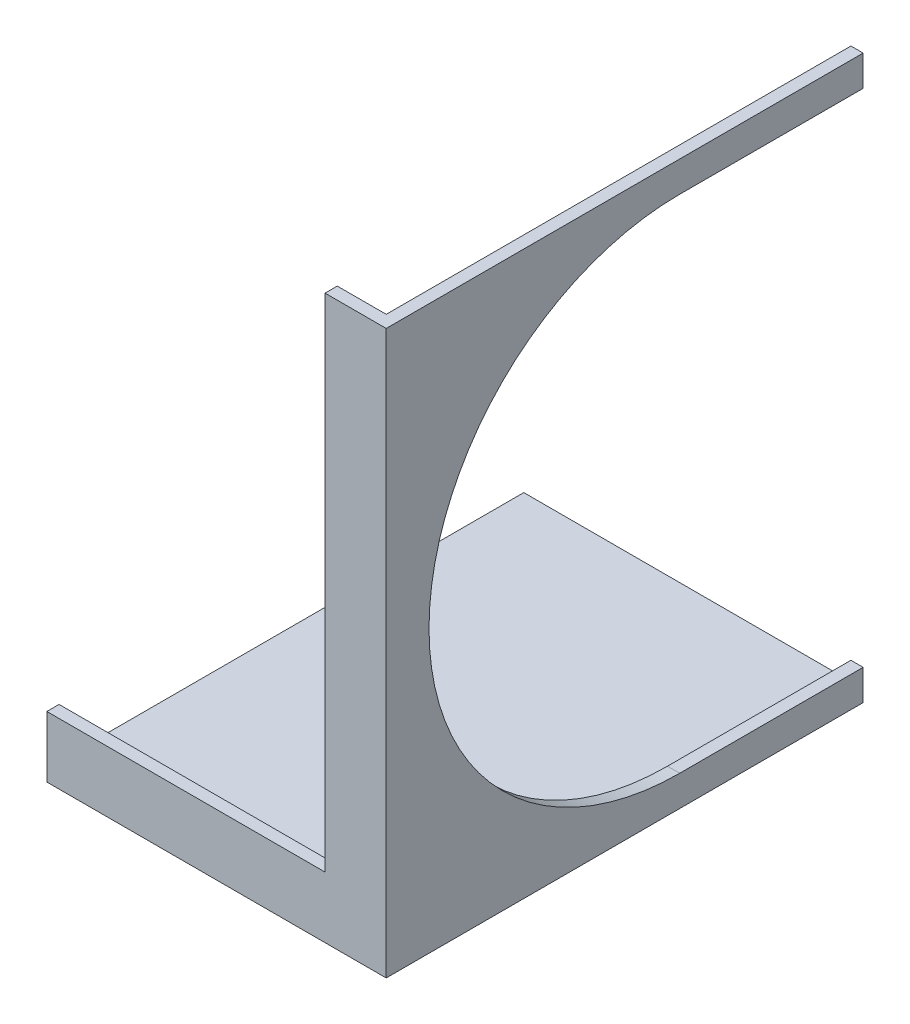
ISO-10303-21;
HEADER;
FILE_DESCRIPTION(('STEP AP214'),'2;1');
FILE_NAME('part.step','',(''),(''),'','','');
FILE_SCHEMA(('AUTOMOTIVE_DESIGN { 1 0 10303 214 1 1 1 1 }'));
ENDSEC;
DATA;
#1=APPLICATION_CONTEXT('core data for automotive mechanical design processes');
#2=APPLICATION_PROTOCOL_DEFINITION('international standard','automotive_design',2000,#1);
#3=PRODUCT_CONTEXT('',#1,'mechanical');
#4=PRODUCT('Part','Part','',(#3));
#5=PRODUCT_RELATED_PRODUCT_CATEGORY('part','',(#4));
#6=PRODUCT_DEFINITION_FORMATION('','',#4);
#7=PRODUCT_DEFINITION_CONTEXT('part definition',#1,'design');
#8=PRODUCT_DEFINITION('design','',#6,#7);
#9=PRODUCT_DEFINITION_SHAPE('','',#8);
#10=(LENGTH_UNIT() NAMED_UNIT(*) SI_UNIT(.MILLI.,.METRE.));
#11=(NAMED_UNIT(*) PLANE_ANGLE_UNIT() SI_UNIT($,.RADIAN.));
#12=(NAMED_UNIT(*) SI_UNIT($,.STERADIAN.) SOLID_ANGLE_UNIT());
#13=UNCERTAINTY_MEASURE_WITH_UNIT(LENGTH_MEASURE(1.E-05),#10,'distance_accuracy_value','');
#14=(GEOMETRIC_REPRESENTATION_CONTEXT(3) GLOBAL_UNCERTAINTY_ASSIGNED_CONTEXT((#13)) GLOBAL_UNIT_ASSIGNED_CONTEXT((#10,
#11,#12)) REPRESENTATION_CONTEXT('',''));
#15=CARTESIAN_POINT('',(0.,0.,0.));
#16=DIRECTION('',(0.,0.,1.));
#17=DIRECTION('',(1.,0.,0.));
#18=AXIS2_PLACEMENT_3D('',#15,#16,#17);
#19=CARTESIAN_POINT('',(0.,0.,0.));
#20=DIRECTION('',(0.,0.,1.));
#21=DIRECTION('',(1.,0.,0.));
#22=AXIS2_PLACEMENT_3D('',#19,#20,#21);
#23=PLANE('',#22);
#24=DIRECTION('',(0.,1.,0.));
#25=VECTOR('',#24,1.);
#26=CARTESIAN_POINT('',(0.,0.,0.));
#27=LINE('',#26,#25);
#28=CARTESIAN_POINT('',(0.,87.,0.));
#29=VERTEX_POINT('',#28);
#30=CARTESIAN_POINT('',(0.,92.,0.));
#31=VERTEX_POINT('',#30);
#32=EDGE_CURVE('E112',#29,#31,#27,.T.);
#33=ORIENTED_EDGE('',*,*,#32,.F.);
#34=DIRECTION('',(-1.,0.,0.));
#35=VECTOR('',#34,1.);
#36=CARTESIAN_POINT('',(0.,87.,0.));
#37=LINE('',#36,#35);
#38=CARTESIAN_POINT('',(-1.99999999999999,87.,0.));
#39=VERTEX_POINT('',#38);
#40=EDGE_CURVE('E43',#29,#39,#37,.T.);
#41=ORIENTED_EDGE('',*,*,#40,.T.);
#42=DIRECTION('',(0.,-1.,0.));
#43=VECTOR('',#42,1.);
#44=CARTESIAN_POINT('',(-2.,92.,0.));
#45=LINE('',#44,#43);
#46=CARTESIAN_POINT('',(-2.,92.,0.));
#47=VERTEX_POINT('',#46);
#48=EDGE_CURVE('E94',#47,#39,#45,.T.);
#49=ORIENTED_EDGE('',*,*,#48,.F.);
#50=DIRECTION('',(-1.,0.,0.));
#51=VECTOR('',#50,1.);
#52=CARTESIAN_POINT('',(0.,92.,0.));
#53=LINE('',#52,#51);
#54=EDGE_CURVE('E123',#31,#47,#53,.T.);
#55=ORIENTED_EDGE('',*,*,#54,.F.);
#56=EDGE_LOOP('',(#33,#41,#49,#55));
#57=FACE_BOUND('',#56,.T.);
#58=ADVANCED_FACE('F35',(#57),#23,.F.);
#59=CARTESIAN_POINT('',(-55.5,2.,76.));
#60=DIRECTION('',(1.,0.,0.));
#61=DIRECTION('',(0.,0.,-1.));
#62=AXIS2_PLACEMENT_3D('',#59,#60,#61);
#63=PLANE('',#62);
#64=DIRECTION('',(0.,-1.,0.));
#65=VECTOR('',#64,1.);
#66=CARTESIAN_POINT('',(-55.5,2.,0.));
#67=LINE('',#66,#65);
#68=CARTESIAN_POINT('',(-55.5,2.,0.));
#69=VERTEX_POINT('',#68);
#70=CARTESIAN_POINT('',(-55.5,0.,0.));
#71=VERTEX_POINT('',#70);
#72=EDGE_CURVE('E100',#69,#71,#67,.T.);
#73=ORIENTED_EDGE('',*,*,#72,.T.);
#74=DIRECTION('',(0.,0.,-1.));
#75=VECTOR('',#74,1.);
#76=CARTESIAN_POINT('',(-55.5,0.,76.));
#77=LINE('',#76,#75);
#78=CARTESIAN_POINT('',(-55.5,0.,78.));
#79=VERTEX_POINT('',#78);
#80=EDGE_CURVE('E138',#79,#71,#77,.T.);
#81=ORIENTED_EDGE('',*,*,#80,.F.);
#82=DIRECTION('',(0.,-1.,0.));
#83=VECTOR('',#82,1.);
#84=CARTESIAN_POINT('',(-55.5,9.99999999999999,78.));
#85=LINE('',#84,#83);
#86=CARTESIAN_POINT('',(-55.5,9.99999999999999,78.));
#87=VERTEX_POINT('',#86);
#88=EDGE_CURVE('E283',#87,#79,#85,.T.);
#89=ORIENTED_EDGE('',*,*,#88,.F.);
#90=DIRECTION('',(0.,0.,-1.));
#91=VECTOR('',#90,1.);
#92=CARTESIAN_POINT('',(-55.5,9.99999999999999,78.));
#93=LINE('',#92,#91);
#94=CARTESIAN_POINT('',(-55.5,9.99999999999999,76.));
#95=VERTEX_POINT('',#94);
#96=EDGE_CURVE('E235',#87,#95,#93,.T.);
#97=ORIENTED_EDGE('',*,*,#96,.T.);
#98=DIRECTION('',(0.,-1.,0.));
#99=VECTOR('',#98,1.);
#100=CARTESIAN_POINT('',(-55.5,9.99999999999999,76.));
#101=LINE('',#100,#99);
#102=CARTESIAN_POINT('',(-55.5,2.,76.));
#103=VERTEX_POINT('',#102);
#104=EDGE_CURVE('E103',#95,#103,#101,.T.);
#105=ORIENTED_EDGE('',*,*,#104,.T.);
#106=DIRECTION('',(0.,0.,-1.));
#107=VECTOR('',#106,1.);
#108=CARTESIAN_POINT('',(-55.5,2.,76.));
#109=LINE('',#108,#107);
#110=EDGE_CURVE('E88',#103,#69,#109,.T.);
#111=ORIENTED_EDGE('',*,*,#110,.T.);
#112=EDGE_LOOP('',(#73,#81,#89,#97,#105,#111));
#113=FACE_BOUND('',#112,.T.);
#114=ADVANCED_FACE('F37',(#113),#63,.F.);
#115=CARTESIAN_POINT('',(-55.5,0.,76.));
#116=DIRECTION('',(0.,1.,0.));
#117=DIRECTION('',(0.,0.,1.));
#118=AXIS2_PLACEMENT_3D('',#115,#116,#117);
#119=PLANE('',#118);
#120=DIRECTION('',(1.,0.,0.));
#121=VECTOR('',#120,1.);
#122=CARTESIAN_POINT('',(-55.5,0.,0.));
#123=LINE('',#122,#121);
#124=CARTESIAN_POINT('',(0.,0.,0.));
#125=VERTEX_POINT('',#124);
#126=EDGE_CURVE('E108',#71,#125,#123,.T.);
#127=ORIENTED_EDGE('',*,*,#126,.T.);
#128=DIRECTION('',(0.,0.,-1.));
#129=VECTOR('',#128,1.);
#130=CARTESIAN_POINT('',(0.,0.,76.));
#131=LINE('',#130,#129);
#132=CARTESIAN_POINT('',(0.,0.,78.));
#133=VERTEX_POINT('',#132);
#134=EDGE_CURVE('E135',#133,#125,#131,.T.);
#135=ORIENTED_EDGE('',*,*,#134,.F.);
#136=DIRECTION('',(1.,0.,0.));
#137=VECTOR('',#136,1.);
#138=CARTESIAN_POINT('',(-55.5,0.,78.));
#139=LINE('',#138,#137);
#140=EDGE_CURVE('E238',#79,#133,#139,.T.);
#141=ORIENTED_EDGE('',*,*,#140,.F.);
#142=ORIENTED_EDGE('',*,*,#80,.T.);
#143=EDGE_LOOP('',(#127,#135,#141,#142));
#144=FACE_BOUND('',#143,.T.);
#145=ADVANCED_FACE('F260',(#144),#119,.F.);
#146=CARTESIAN_POINT('',(0.,0.,76.));
#147=DIRECTION('',(-1.,0.,0.));
#148=DIRECTION('',(0.,0.,1.));
#149=AXIS2_PLACEMENT_3D('',#146,#147,#148);
#150=PLANE('',#149);
#151=CARTESIAN_POINT('',(0.,46.,30.));
#152=DIRECTION('',(1.,0.,0.));
#153=DIRECTION('',(0.,0.,-1.));
#154=AXIS2_PLACEMENT_3D('',#151,#152,#153);
#155=CIRCLE('',#154,41.);
#156=CARTESIAN_POINT('',(0.,87.,30.));
#157=VERTEX_POINT('',#156);
#158=CARTESIAN_POINT('',(0.,4.99999999999999,30.));
#159=VERTEX_POINT('',#158);
#160=EDGE_CURVE('E243',#157,#159,#155,.T.);
#161=ORIENTED_EDGE('',*,*,#160,.F.);
#162=DIRECTION('',(0.,0.,1.));
#163=VECTOR('',#162,1.);
#164=CARTESIAN_POINT('',(0.,87.,30.));
#165=LINE('',#164,#163);
#166=EDGE_CURVE('E218',#29,#157,#165,.T.);
#167=ORIENTED_EDGE('',*,*,#166,.F.);
#168=ORIENTED_EDGE('',*,*,#32,.T.);
#169=DIRECTION('',(0.,0.,-1.));
#170=VECTOR('',#169,1.);
#171=CARTESIAN_POINT('',(0.,92.,76.));
#172=LINE('',#171,#170);
#173=CARTESIAN_POINT('',(0.,92.,78.));
#174=VERTEX_POINT('',#173);
#175=EDGE_CURVE('E132',#174,#31,#172,.T.);
#176=ORIENTED_EDGE('',*,*,#175,.F.);
#177=DIRECTION('',(0.,1.,0.));
#178=VECTOR('',#177,1.);
#179=CARTESIAN_POINT('',(0.,0.,78.));
#180=LINE('',#179,#178);
#181=EDGE_CURVE('E176',#133,#174,#180,.T.);
#182=ORIENTED_EDGE('',*,*,#181,.F.);
#183=ORIENTED_EDGE('',*,*,#134,.T.);
#184=CARTESIAN_POINT('',(0.,4.99999999999999,0.));
#185=VERTEX_POINT('',#184);
#186=EDGE_CURVE('E120',#125,#185,#27,.T.);
#187=ORIENTED_EDGE('',*,*,#186,.T.);
#188=DIRECTION('',(0.,0.,-1.));
#189=VECTOR('',#188,1.);
#190=CARTESIAN_POINT('',(0.,4.99999999999999,30.));
#191=LINE('',#190,#189);
#192=EDGE_CURVE('E50',#159,#185,#191,.T.);
#193=ORIENTED_EDGE('',*,*,#192,.F.);
#194=EDGE_LOOP('',(#161,#167,#168,#176,#182,#183,#187,#193));
#195=FACE_BOUND('',#194,.T.);
#196=ADVANCED_FACE('F174',(#195),#150,.F.);
#197=CARTESIAN_POINT('',(0.,92.,76.));
#198=DIRECTION('',(0.,-1.,0.));
#199=DIRECTION('',(0.,0.,-1.));
#200=AXIS2_PLACEMENT_3D('',#197,#198,#199);
#201=PLANE('',#200);
#202=ORIENTED_EDGE('',*,*,#54,.T.);
#203=DIRECTION('',(0.,0.,-1.));
#204=VECTOR('',#203,1.);
#205=CARTESIAN_POINT('',(-2.,92.,76.));
#206=LINE('',#205,#204);
#207=CARTESIAN_POINT('',(-2.,92.,76.));
#208=VERTEX_POINT('',#207);
#209=EDGE_CURVE('E129',#208,#47,#206,.T.);
#210=ORIENTED_EDGE('',*,*,#209,.F.);
#211=DIRECTION('',(-1.,0.,0.));
#212=VECTOR('',#211,1.);
#213=CARTESIAN_POINT('',(0.,92.,76.));
#214=LINE('',#213,#212);
#215=CARTESIAN_POINT('',(-10.,92.,76.));
#216=VERTEX_POINT('',#215);
#217=EDGE_CURVE('E163',#208,#216,#214,.T.);
#218=ORIENTED_EDGE('',*,*,#217,.T.);
#219=DIRECTION('',(0.,0.,-1.));
#220=VECTOR('',#219,1.);
#221=CARTESIAN_POINT('',(-10.,92.,78.));
#222=LINE('',#221,#220);
#223=CARTESIAN_POINT('',(-10.,92.,78.));
#224=VERTEX_POINT('',#223);
#225=EDGE_CURVE('E241',#224,#216,#222,.T.);
#226=ORIENTED_EDGE('',*,*,#225,.F.);
#227=DIRECTION('',(-1.,0.,0.));
#228=VECTOR('',#227,1.);
#229=CARTESIAN_POINT('',(0.,92.,78.));
#230=LINE('',#229,#228);
#231=EDGE_CURVE('E169',#174,#224,#230,.T.);
#232=ORIENTED_EDGE('',*,*,#231,.F.);
#233=ORIENTED_EDGE('',*,*,#175,.T.);
#234=EDGE_LOOP('',(#202,#210,#218,#226,#232,#233));
#235=FACE_BOUND('',#234,.T.);
#236=ADVANCED_FACE('F160',(#235),#201,.F.);
#237=CARTESIAN_POINT('',(-2.,92.,76.));
#238=DIRECTION('',(1.,0.,0.));
#239=DIRECTION('',(0.,1.,0.));
#240=AXIS2_PLACEMENT_3D('',#237,#238,#239);
#241=PLANE('',#240);
#242=ORIENTED_EDGE('',*,*,#48,.T.);
#243=DIRECTION('',(0.,0.,1.));
#244=VECTOR('',#243,1.);
#245=CARTESIAN_POINT('',(-2.,87.,76.));
#246=LINE('',#245,#244);
#247=CARTESIAN_POINT('',(-2.,87.,30.));
#248=VERTEX_POINT('',#247);
#249=EDGE_CURVE('E110',#39,#248,#246,.T.);
#250=ORIENTED_EDGE('',*,*,#249,.T.);
#251=CARTESIAN_POINT('',(-2.,46.,30.));
#252=DIRECTION('',(1.,0.,0.));
#253=DIRECTION('',(0.,1.,0.));
#254=AXIS2_PLACEMENT_3D('',#251,#252,#253);
#255=CIRCLE('',#254,41.);
#256=CARTESIAN_POINT('',(-1.99999999999999,4.99999999999999,30.));
#257=VERTEX_POINT('',#256);
#258=EDGE_CURVE('E11',#248,#257,#255,.T.);
#259=ORIENTED_EDGE('',*,*,#258,.T.);
#260=DIRECTION('',(0.,0.,-1.));
#261=VECTOR('',#260,1.);
#262=CARTESIAN_POINT('',(-1.99999999999999,4.99999999999996,76.));
#263=LINE('',#262,#261);
#264=CARTESIAN_POINT('',(-1.99999999999999,5.,0.));
#265=VERTEX_POINT('',#264);
#266=EDGE_CURVE('E115',#257,#265,#263,.T.);
#267=ORIENTED_EDGE('',*,*,#266,.T.);
#268=CARTESIAN_POINT('',(-1.99999999999999,2.00000000000001,0.));
#269=VERTEX_POINT('',#268);
#270=EDGE_CURVE('E125',#265,#269,#45,.T.);
#271=ORIENTED_EDGE('',*,*,#270,.T.);
#272=DIRECTION('',(0.,0.,-1.));
#273=VECTOR('',#272,1.);
#274=CARTESIAN_POINT('',(-1.99999999999999,2.00000000000001,76.));
#275=LINE('',#274,#273);
#276=CARTESIAN_POINT('',(-1.99999999999999,2.00000000000001,76.));
#277=VERTEX_POINT('',#276);
#278=EDGE_CURVE('E59',#277,#269,#275,.T.);
#279=ORIENTED_EDGE('',*,*,#278,.F.);
#280=DIRECTION('',(0.,-1.,0.));
#281=VECTOR('',#280,1.);
#282=CARTESIAN_POINT('',(-2.,92.,76.));
#283=LINE('',#282,#281);
#284=EDGE_CURVE('E93',#208,#277,#283,.T.);
#285=ORIENTED_EDGE('',*,*,#284,.F.);
#286=ORIENTED_EDGE('',*,*,#209,.T.);
#287=EDGE_LOOP('',(#242,#250,#259,#267,#271,#279,#285,#286));
#288=FACE_BOUND('',#287,.T.);
#289=ADVANCED_FACE('F155',(#288),#241,.F.);
#290=CARTESIAN_POINT('',(-1.99999999999999,2.00000000000001,76.));
#291=DIRECTION('',(0.,-1.,0.));
#292=DIRECTION('',(1.,0.,0.));
#293=AXIS2_PLACEMENT_3D('',#290,#291,#292);
#294=PLANE('',#293);
#295=DIRECTION('',(-1.,0.,0.));
#296=VECTOR('',#295,1.);
#297=CARTESIAN_POINT('',(-1.99999999999999,2.00000000000001,0.));
#298=LINE('',#297,#296);
#299=EDGE_CURVE('E84',#269,#69,#298,.T.);
#300=ORIENTED_EDGE('',*,*,#299,.T.);
#301=ORIENTED_EDGE('',*,*,#110,.F.);
#302=DIRECTION('',(-1.,0.,0.));
#303=VECTOR('',#302,1.);
#304=CARTESIAN_POINT('',(-1.99999999999999,2.00000000000001,76.));
#305=LINE('',#304,#303);
#306=EDGE_CURVE('E104',#277,#103,#305,.T.);
#307=ORIENTED_EDGE('',*,*,#306,.F.);
#308=ORIENTED_EDGE('',*,*,#278,.T.);
#309=EDGE_LOOP('',(#300,#301,#307,#308));
#310=FACE_BOUND('',#309,.T.);
#311=ADVANCED_FACE('F86',(#310),#294,.F.);
#312=ORIENTED_EDGE('',*,*,#270,.F.);
#313=DIRECTION('',(1.,0.,0.));
#314=VECTOR('',#313,1.);
#315=CARTESIAN_POINT('',(0.,5.,0.));
#316=LINE('',#315,#314);
#317=EDGE_CURVE('E140',#265,#185,#316,.T.);
#318=ORIENTED_EDGE('',*,*,#317,.T.);
#319=ORIENTED_EDGE('',*,*,#186,.F.);
#320=ORIENTED_EDGE('',*,*,#126,.F.);
#321=ORIENTED_EDGE('',*,*,#72,.F.);
#322=ORIENTED_EDGE('',*,*,#299,.F.);
#323=EDGE_LOOP('',(#312,#318,#319,#320,#321,#322));
#324=FACE_BOUND('',#323,.T.);
#325=ADVANCED_FACE('F106',(#324),#23,.F.);
#326=CARTESIAN_POINT('',(-70.,46.,30.));
#327=DIRECTION('',(1.,0.,0.));
#328=DIRECTION('',(0.,0.,-1.));
#329=AXIS2_PLACEMENT_3D('',#326,#327,#328);
#330=CYLINDRICAL_SURFACE('',#329,41.);
#331=DIRECTION('',(1.,0.,0.));
#332=VECTOR('',#331,1.);
#333=CARTESIAN_POINT('',(-70.,87.,30.));
#334=LINE('',#333,#332);
#335=EDGE_CURVE('E214',#248,#157,#334,.T.);
#336=ORIENTED_EDGE('',*,*,#335,.T.);
#337=ORIENTED_EDGE('',*,*,#160,.T.);
#338=DIRECTION('',(1.,0.,0.));
#339=VECTOR('',#338,1.);
#340=CARTESIAN_POINT('',(-70.,4.99999999999999,30.));
#341=LINE('',#340,#339);
#342=EDGE_CURVE('E215',#257,#159,#341,.T.);
#343=ORIENTED_EDGE('',*,*,#342,.F.);
#344=ORIENTED_EDGE('',*,*,#258,.F.);
#345=EDGE_LOOP('',(#336,#337,#343,#344));
#346=FACE_BOUND('',#345,.T.);
#347=ADVANCED_FACE('F212',(#346),#330,.F.);
#348=CARTESIAN_POINT('',(-70.,87.,30.));
#349=DIRECTION('',(0.,1.,0.));
#350=DIRECTION('',(0.,0.,1.));
#351=AXIS2_PLACEMENT_3D('',#348,#349,#350);
#352=PLANE('',#351);
#353=ORIENTED_EDGE('',*,*,#40,.F.);
#354=ORIENTED_EDGE('',*,*,#166,.T.);
#355=ORIENTED_EDGE('',*,*,#335,.F.);
#356=ORIENTED_EDGE('',*,*,#249,.F.);
#357=EDGE_LOOP('',(#353,#354,#355,#356));
#358=FACE_BOUND('',#357,.T.);
#359=ADVANCED_FACE('F217',(#358),#352,.F.);
#360=CARTESIAN_POINT('',(-70.,4.99999999999999,30.));
#361=DIRECTION('',(0.,-1.,0.));
#362=DIRECTION('',(0.,0.,-1.));
#363=AXIS2_PLACEMENT_3D('',#360,#361,#362);
#364=PLANE('',#363);
#365=ORIENTED_EDGE('',*,*,#342,.T.);
#366=ORIENTED_EDGE('',*,*,#192,.T.);
#367=ORIENTED_EDGE('',*,*,#317,.F.);
#368=ORIENTED_EDGE('',*,*,#266,.F.);
#369=EDGE_LOOP('',(#365,#366,#367,#368));
#370=FACE_BOUND('',#369,.T.);
#371=ADVANCED_FACE('F244',(#370),#364,.F.);
#372=CARTESIAN_POINT('',(0.,0.,76.));
#373=DIRECTION('',(0.,0.,1.));
#374=DIRECTION('',(1.,0.,0.));
#375=AXIS2_PLACEMENT_3D('',#372,#373,#374);
#376=PLANE('',#375);
#377=ORIENTED_EDGE('',*,*,#217,.F.);
#378=ORIENTED_EDGE('',*,*,#284,.T.);
#379=ORIENTED_EDGE('',*,*,#306,.T.);
#380=ORIENTED_EDGE('',*,*,#104,.F.);
#381=DIRECTION('',(-1.,0.,0.));
#382=VECTOR('',#381,1.);
#383=CARTESIAN_POINT('',(-9.99999999999999,10.,76.));
#384=LINE('',#383,#382);
#385=CARTESIAN_POINT('',(-9.99999999999999,10.,76.));
#386=VERTEX_POINT('',#385);
#387=EDGE_CURVE('E228',#386,#95,#384,.T.);
#388=ORIENTED_EDGE('',*,*,#387,.F.);
#389=DIRECTION('',(0.,-1.,0.));
#390=VECTOR('',#389,1.);
#391=CARTESIAN_POINT('',(-10.,92.,76.));
#392=LINE('',#391,#390);
#393=EDGE_CURVE('E231',#216,#386,#392,.T.);
#394=ORIENTED_EDGE('',*,*,#393,.F.);
#395=EDGE_LOOP('',(#377,#378,#379,#380,#388,#394));
#396=FACE_BOUND('',#395,.T.);
#397=ADVANCED_FACE('F225',(#396),#376,.F.);
#398=CARTESIAN_POINT('',(-10.,92.,78.));
#399=DIRECTION('',(1.,0.,0.));
#400=DIRECTION('',(0.,1.,0.));
#401=AXIS2_PLACEMENT_3D('',#398,#399,#400);
#402=PLANE('',#401);
#403=ORIENTED_EDGE('',*,*,#393,.T.);
#404=DIRECTION('',(0.,0.,-1.));
#405=VECTOR('',#404,1.);
#406=CARTESIAN_POINT('',(-9.99999999999999,10.,78.));
#407=LINE('',#406,#405);
#408=CARTESIAN_POINT('',(-9.99999999999999,10.,78.));
#409=VERTEX_POINT('',#408);
#410=EDGE_CURVE('E237',#409,#386,#407,.T.);
#411=ORIENTED_EDGE('',*,*,#410,.F.);
#412=DIRECTION('',(0.,-1.,0.));
#413=VECTOR('',#412,1.);
#414=CARTESIAN_POINT('',(-10.,92.,78.));
#415=LINE('',#414,#413);
#416=EDGE_CURVE('E291',#224,#409,#415,.T.);
#417=ORIENTED_EDGE('',*,*,#416,.F.);
#418=ORIENTED_EDGE('',*,*,#225,.T.);
#419=EDGE_LOOP('',(#403,#411,#417,#418));
#420=FACE_BOUND('',#419,.T.);
#421=ADVANCED_FACE('F251',(#420),#402,.F.);
#422=CARTESIAN_POINT('',(-9.99999999999999,10.,78.));
#423=DIRECTION('',(0.,-1.,0.));
#424=DIRECTION('',(1.,0.,0.));
#425=AXIS2_PLACEMENT_3D('',#422,#423,#424);
#426=PLANE('',#425);
#427=ORIENTED_EDGE('',*,*,#387,.T.);
#428=ORIENTED_EDGE('',*,*,#96,.F.);
#429=DIRECTION('',(-1.,0.,0.));
#430=VECTOR('',#429,1.);
#431=CARTESIAN_POINT('',(-9.99999999999999,10.,78.));
#432=LINE('',#431,#430);
#433=EDGE_CURVE('E287',#409,#87,#432,.T.);
#434=ORIENTED_EDGE('',*,*,#433,.F.);
#435=ORIENTED_EDGE('',*,*,#410,.T.);
#436=EDGE_LOOP('',(#427,#428,#434,#435));
#437=FACE_BOUND('',#436,.T.);
#438=ADVANCED_FACE('F299',(#437),#426,.F.);
#439=CARTESIAN_POINT('',(0.,0.,78.));
#440=DIRECTION('',(0.,0.,1.));
#441=DIRECTION('',(1.,0.,0.));
#442=AXIS2_PLACEMENT_3D('',#439,#440,#441);
#443=PLANE('',#442);
#444=ORIENTED_EDGE('',*,*,#181,.T.);
#445=ORIENTED_EDGE('',*,*,#231,.T.);
#446=ORIENTED_EDGE('',*,*,#416,.T.);
#447=ORIENTED_EDGE('',*,*,#433,.T.);
#448=ORIENTED_EDGE('',*,*,#88,.T.);
#449=ORIENTED_EDGE('',*,*,#140,.T.);
#450=EDGE_LOOP('',(#444,#445,#446,#447,#448,#449));
#451=FACE_BOUND('',#450,.T.);
#452=ADVANCED_FACE('F285',(#451),#443,.T.);
#453=CLOSED_SHELL('',(#58,#114,#145,#196,#236,#289,#311,#325,#347,#359,#371,#397,#421,#438,#452));
#454=MANIFOLD_SOLID_BREP('B2',#453);
#455=ADVANCED_BREP_SHAPE_REPRESENTATION('',(#18,#454),#14);
#456=SHAPE_DEFINITION_REPRESENTATION(#9,#455);
ENDSEC;
END-ISO-10303-21;
